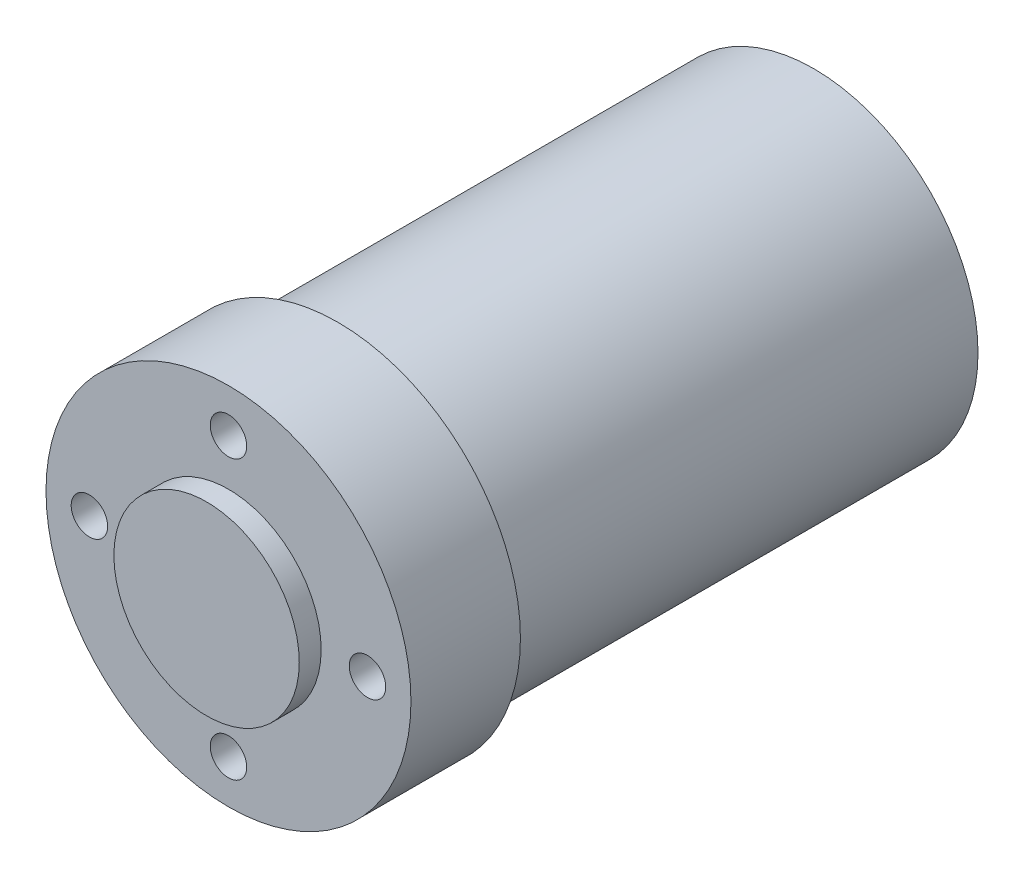
ISO-10303-21;
HEADER;
FILE_DESCRIPTION(('STEP AP214'),'2;1');
FILE_NAME('part.step','',(''),(''),'','','');
FILE_SCHEMA(('AUTOMOTIVE_DESIGN { 1 0 10303 214 1 1 1 1 }'));
ENDSEC;
DATA;
#1=APPLICATION_CONTEXT('core data for automotive mechanical design processes');
#2=APPLICATION_PROTOCOL_DEFINITION('international standard','automotive_design',2000,#1);
#3=PRODUCT_CONTEXT('',#1,'mechanical');
#4=PRODUCT('Part','Part','',(#3));
#5=PRODUCT_RELATED_PRODUCT_CATEGORY('part','',(#4));
#6=PRODUCT_DEFINITION_FORMATION('','',#4);
#7=PRODUCT_DEFINITION_CONTEXT('part definition',#1,'design');
#8=PRODUCT_DEFINITION('design','',#6,#7);
#9=PRODUCT_DEFINITION_SHAPE('','',#8);
#10=(LENGTH_UNIT() NAMED_UNIT(*) SI_UNIT(.MILLI.,.METRE.));
#11=(NAMED_UNIT(*) PLANE_ANGLE_UNIT() SI_UNIT($,.RADIAN.));
#12=(NAMED_UNIT(*) SI_UNIT($,.STERADIAN.) SOLID_ANGLE_UNIT());
#13=UNCERTAINTY_MEASURE_WITH_UNIT(LENGTH_MEASURE(1.E-05),#10,'distance_accuracy_value','');
#14=(GEOMETRIC_REPRESENTATION_CONTEXT(3) GLOBAL_UNCERTAINTY_ASSIGNED_CONTEXT((#13)) GLOBAL_UNIT_ASSIGNED_CONTEXT((#10,
#11,#12)) REPRESENTATION_CONTEXT('',''));
#15=CARTESIAN_POINT('',(0.,0.,0.));
#16=DIRECTION('',(0.,0.,1.));
#17=DIRECTION('',(1.,0.,0.));
#18=AXIS2_PLACEMENT_3D('',#15,#16,#17);
#19=CARTESIAN_POINT('',(0.,0.,80.));
#20=DIRECTION('',(0.,0.,-1.));
#21=DIRECTION('',(-1.,0.,0.));
#22=AXIS2_PLACEMENT_3D('',#19,#20,#21);
#23=CYLINDRICAL_SURFACE('',#22,25.);
#24=CARTESIAN_POINT('',(0.,0.,80.));
#25=DIRECTION('',(0.,0.,-1.));
#26=DIRECTION('',(-1.,0.,0.));
#27=AXIS2_PLACEMENT_3D('',#24,#25,#26);
#28=CIRCLE('',#27,25.);
#29=CARTESIAN_POINT('',(-25.,0.,80.));
#30=VERTEX_POINT('',#29);
#31=EDGE_CURVE('E43',#30,#30,#28,.T.);
#32=ORIENTED_EDGE('',*,*,#31,.T.);
#33=EDGE_LOOP('',(#32));
#34=FACE_BOUND('',#33,.T.);
#35=CARTESIAN_POINT('',(0.,0.,65.));
#36=DIRECTION('',(0.,0.,-1.));
#37=DIRECTION('',(-1.,0.,0.));
#38=AXIS2_PLACEMENT_3D('',#35,#36,#37);
#39=CIRCLE('',#38,25.);
#40=CARTESIAN_POINT('',(-25.,0.,65.));
#41=VERTEX_POINT('',#40);
#42=EDGE_CURVE('E168',#41,#41,#39,.T.);
#43=ORIENTED_EDGE('',*,*,#42,.F.);
#44=EDGE_LOOP('',(#43));
#45=FACE_BOUND('',#44,.T.);
#46=ADVANCED_FACE('F40',(#34,#45),#23,.T.);
#47=CARTESIAN_POINT('',(25.,0.,80.));
#48=DIRECTION('',(0.,0.,1.));
#49=DIRECTION('',(1.,0.,0.));
#50=AXIS2_PLACEMENT_3D('',#47,#48,#49);
#51=PLANE('',#50);
#52=CARTESIAN_POINT('',(-19.0499999999995,-5.41433564649196E-13,80.));
#53=DIRECTION('',(0.,0.,1.));
#54=DIRECTION('',(1.,0.,0.));
#55=AXIS2_PLACEMENT_3D('',#52,#53,#54);
#56=CIRCLE('',#55,2.5);
#57=CARTESIAN_POINT('',(-16.5499999999995,-5.41433564649196E-13,80.));
#58=VERTEX_POINT('',#57);
#59=EDGE_CURVE('E90',#58,#58,#56,.T.);
#60=ORIENTED_EDGE('',*,*,#59,.F.);
#61=EDGE_LOOP('',(#60));
#62=FACE_BOUND('',#61,.T.);
#63=CARTESIAN_POINT('',(1.07820122499364E-12,-19.05,80.));
#64=DIRECTION('',(0.,0.,1.));
#65=DIRECTION('',(1.,0.,0.));
#66=AXIS2_PLACEMENT_3D('',#63,#64,#65);
#67=CIRCLE('',#66,2.5);
#68=CARTESIAN_POINT('',(2.50000000000108,-19.05,80.));
#69=VERTEX_POINT('',#68);
#70=EDGE_CURVE('E89',#69,#69,#67,.T.);
#71=ORIENTED_EDGE('',*,*,#70,.F.);
#72=EDGE_LOOP('',(#71));
#73=FACE_BOUND('',#72,.T.);
#74=CARTESIAN_POINT('',(19.0500000000005,5.39100612496821E-13,80.));
#75=DIRECTION('',(0.,0.,1.));
#76=DIRECTION('',(1.,0.,0.));
#77=AXIS2_PLACEMENT_3D('',#74,#75,#76);
#78=CIRCLE('',#77,2.5);
#79=CARTESIAN_POINT('',(21.5500000000005,5.39100612496821E-13,80.));
#80=VERTEX_POINT('',#79);
#81=EDGE_CURVE('E104',#80,#80,#78,.T.);
#82=ORIENTED_EDGE('',*,*,#81,.F.);
#83=EDGE_LOOP('',(#82));
#84=FACE_BOUND('',#83,.T.);
#85=CARTESIAN_POINT('',(0.,19.05,80.));
#86=DIRECTION('',(0.,0.,1.));
#87=DIRECTION('',(1.,0.,0.));
#88=AXIS2_PLACEMENT_3D('',#85,#86,#87);
#89=CIRCLE('',#88,2.5);
#90=CARTESIAN_POINT('',(2.5,19.05,80.));
#91=VERTEX_POINT('',#90);
#92=EDGE_CURVE('E112',#91,#91,#89,.T.);
#93=ORIENTED_EDGE('',*,*,#92,.F.);
#94=EDGE_LOOP('',(#93));
#95=FACE_BOUND('',#94,.T.);
#96=CARTESIAN_POINT('',(0.,0.,80.));
#97=DIRECTION('',(0.,0.,1.));
#98=DIRECTION('',(1.,0.,0.));
#99=AXIS2_PLACEMENT_3D('',#96,#97,#98);
#100=CIRCLE('',#99,12.7);
#101=CARTESIAN_POINT('',(12.7,0.,80.));
#102=VERTEX_POINT('',#101);
#103=EDGE_CURVE('E49',#102,#102,#100,.T.);
#104=ORIENTED_EDGE('',*,*,#103,.F.);
#105=EDGE_LOOP('',(#104));
#106=FACE_BOUND('',#105,.T.);
#107=ORIENTED_EDGE('',*,*,#31,.F.);
#108=EDGE_LOOP('',(#107));
#109=FACE_BOUND('',#108,.T.);
#110=ADVANCED_FACE('F183',(#62,#73,#84,#95,#106,#109),#51,.T.);
#111=CARTESIAN_POINT('',(0.,0.,65.));
#112=DIRECTION('',(0.,0.,-1.));
#113=DIRECTION('',(-1.,0.,0.));
#114=AXIS2_PLACEMENT_3D('',#111,#112,#113);
#115=PLANE('',#114);
#116=CARTESIAN_POINT('',(0.,0.,65.));
#117=DIRECTION('',(0.,0.,-1.));
#118=DIRECTION('',(-1.,0.,0.));
#119=AXIS2_PLACEMENT_3D('',#116,#117,#118);
#120=CIRCLE('',#119,22.4917);
#121=CARTESIAN_POINT('',(-22.4917,0.,65.));
#122=VERTEX_POINT('',#121);
#123=EDGE_CURVE('E11',#122,#122,#120,.T.);
#124=ORIENTED_EDGE('',*,*,#123,.F.);
#125=EDGE_LOOP('',(#124));
#126=FACE_BOUND('',#125,.T.);
#127=ORIENTED_EDGE('',*,*,#42,.T.);
#128=EDGE_LOOP('',(#127));
#129=FACE_BOUND('',#128,.T.);
#130=ADVANCED_FACE('F185',(#126,#129),#115,.T.);
#131=CARTESIAN_POINT('',(0.,0.,83.));
#132=DIRECTION('',(0.,0.,-1.));
#133=DIRECTION('',(-1.,0.,0.));
#134=AXIS2_PLACEMENT_3D('',#131,#132,#133);
#135=CYLINDRICAL_SURFACE('',#134,12.7);
#136=CARTESIAN_POINT('',(0.,0.,83.));
#137=DIRECTION('',(0.,0.,1.));
#138=DIRECTION('',(1.,0.,0.));
#139=AXIS2_PLACEMENT_3D('',#136,#137,#138);
#140=CIRCLE('',#139,12.7);
#141=CARTESIAN_POINT('',(12.7,0.,83.));
#142=VERTEX_POINT('',#141);
#143=EDGE_CURVE('E163',#142,#142,#140,.T.);
#144=ORIENTED_EDGE('',*,*,#143,.F.);
#145=EDGE_LOOP('',(#144));
#146=FACE_BOUND('',#145,.T.);
#147=ORIENTED_EDGE('',*,*,#103,.T.);
#148=EDGE_LOOP('',(#147));
#149=FACE_BOUND('',#148,.T.);
#150=ADVANCED_FACE('F191',(#146,#149),#135,.T.);
#151=CARTESIAN_POINT('',(0.,0.,83.));
#152=DIRECTION('',(0.,0.,1.));
#153=DIRECTION('',(1.,0.,0.));
#154=AXIS2_PLACEMENT_3D('',#151,#152,#153);
#155=PLANE('',#154);
#156=ORIENTED_EDGE('',*,*,#143,.T.);
#157=EDGE_LOOP('',(#156));
#158=FACE_BOUND('',#157,.T.);
#159=ADVANCED_FACE('F199',(#158),#155,.T.);
#160=CARTESIAN_POINT('',(0.,0.,-0.200000000000006));
#161=DIRECTION('',(0.,0.,1.));
#162=DIRECTION('',(1.,0.,0.));
#163=AXIS2_PLACEMENT_3D('',#160,#161,#162);
#164=CYLINDRICAL_SURFACE('',#163,22.4917);
#165=CARTESIAN_POINT('',(0.,0.,-0.200000000000006));
#166=DIRECTION('',(0.,0.,-1.));
#167=DIRECTION('',(-1.,0.,0.));
#168=AXIS2_PLACEMENT_3D('',#165,#166,#167);
#169=CIRCLE('',#168,22.4917);
#170=CARTESIAN_POINT('',(-22.4917,0.,-0.200000000000006));
#171=VERTEX_POINT('',#170);
#172=EDGE_CURVE('E160',#171,#171,#169,.T.);
#173=ORIENTED_EDGE('',*,*,#172,.F.);
#174=EDGE_LOOP('',(#173));
#175=FACE_BOUND('',#174,.T.);
#176=ORIENTED_EDGE('',*,*,#123,.T.);
#177=EDGE_LOOP('',(#176));
#178=FACE_BOUND('',#177,.T.);
#179=ADVANCED_FACE('F203',(#175,#178),#164,.T.);
#180=CARTESIAN_POINT('',(0.,0.,-0.200000000000006));
#181=DIRECTION('',(0.,0.,-1.));
#182=DIRECTION('',(-1.,0.,0.));
#183=AXIS2_PLACEMENT_3D('',#180,#181,#182);
#184=PLANE('',#183);
#185=CARTESIAN_POINT('',(0.,17.5,-0.200000000000006));
#186=DIRECTION('',(0.,0.,-1.));
#187=DIRECTION('',(-1.,0.,0.));
#188=AXIS2_PLACEMENT_3D('',#185,#186,#187);
#189=CIRCLE('',#188,2.5);
#190=CARTESIAN_POINT('',(-2.5,17.5,-0.200000000000006));
#191=VERTEX_POINT('',#190);
#192=EDGE_CURVE('E120',#191,#191,#189,.T.);
#193=ORIENTED_EDGE('',*,*,#192,.F.);
#194=EDGE_LOOP('',(#193));
#195=FACE_BOUND('',#194,.T.);
#196=CARTESIAN_POINT('',(-16.6434890351657,5.40779740156229,-0.200000000000006));
#197=DIRECTION('',(0.,0.,-1.));
#198=DIRECTION('',(-1.,0.,0.));
#199=AXIS2_PLACEMENT_3D('',#196,#197,#198);
#200=CIRCLE('',#199,2.5);
#201=CARTESIAN_POINT('',(-19.1434890351657,5.40779740156229,-0.200000000000006));
#202=VERTEX_POINT('',#201);
#203=EDGE_CURVE('E128',#202,#202,#200,.T.);
#204=ORIENTED_EDGE('',*,*,#203,.F.);
#205=EDGE_LOOP('',(#204));
#206=FACE_BOUND('',#205,.T.);
#207=CARTESIAN_POINT('',(-10.2862419151196,-14.1577974015611,-0.200000000000006));
#208=DIRECTION('',(0.,0.,-1.));
#209=DIRECTION('',(-1.,0.,0.));
#210=AXIS2_PLACEMENT_3D('',#207,#208,#209);
#211=CIRCLE('',#210,2.5);
#212=CARTESIAN_POINT('',(-12.7862419151196,-14.1577974015611,-0.200000000000006));
#213=VERTEX_POINT('',#212);
#214=EDGE_CURVE('E136',#213,#213,#211,.T.);
#215=ORIENTED_EDGE('',*,*,#214,.F.);
#216=EDGE_LOOP('',(#215));
#217=FACE_BOUND('',#216,.T.);
#218=CARTESIAN_POINT('',(10.2862419151169,-14.157797401562,-0.200000000000006));
#219=DIRECTION('',(0.,0.,-1.));
#220=DIRECTION('',(-1.,0.,0.));
#221=AXIS2_PLACEMENT_3D('',#218,#219,#220);
#222=CIRCLE('',#221,2.5);
#223=CARTESIAN_POINT('',(7.78624191511694,-14.157797401562,-0.200000000000006));
#224=VERTEX_POINT('',#223);
#225=EDGE_CURVE('E144',#224,#224,#222,.T.);
#226=ORIENTED_EDGE('',*,*,#225,.F.);
#227=EDGE_LOOP('',(#226));
#228=FACE_BOUND('',#227,.T.);
#229=CARTESIAN_POINT('',(16.6434890351647,5.40779740156088,-0.200000000000006));
#230=DIRECTION('',(0.,0.,-1.));
#231=DIRECTION('',(-1.,0.,0.));
#232=AXIS2_PLACEMENT_3D('',#229,#230,#231);
#233=CIRCLE('',#232,2.5);
#234=CARTESIAN_POINT('',(14.1434890351647,5.40779740156088,-0.200000000000006));
#235=VERTEX_POINT('',#234);
#236=EDGE_CURVE('E152',#235,#235,#233,.T.);
#237=ORIENTED_EDGE('',*,*,#236,.F.);
#238=EDGE_LOOP('',(#237));
#239=FACE_BOUND('',#238,.T.);
#240=ORIENTED_EDGE('',*,*,#172,.T.);
#241=EDGE_LOOP('',(#240));
#242=FACE_BOUND('',#241,.T.);
#243=ADVANCED_FACE('F207',(#195,#206,#217,#228,#239,#242),#184,.T.);
#244=CARTESIAN_POINT('',(16.6434890351647,5.40779740156088,9.79999999999999));
#245=DIRECTION('',(0.,0.,-1.));
#246=DIRECTION('',(-1.,0.,0.));
#247=AXIS2_PLACEMENT_3D('',#244,#245,#246);
#248=CONICAL_SURFACE('',#247,2.5,1.02974425867665);
#249=CARTESIAN_POINT('',(16.6434890351647,5.40779740156088,11.3021515475689));
#250=VERTEX_POINT('',#249);
#251=VERTEX_LOOP('',#250);
#252=FACE_BOUND('',#251,.T.);
#253=CARTESIAN_POINT('',(16.6434890351647,5.40779740156088,9.79999999999999));
#254=DIRECTION('',(0.,0.,-1.));
#255=DIRECTION('',(-1.,0.,0.));
#256=AXIS2_PLACEMENT_3D('',#253,#254,#255);
#257=CIRCLE('',#256,2.5);
#258=CARTESIAN_POINT('',(14.1434890351647,5.40779740156088,9.79999999999999));
#259=VERTEX_POINT('',#258);
#260=EDGE_CURVE('E156',#259,#259,#257,.T.);
#261=ORIENTED_EDGE('',*,*,#260,.T.);
#262=EDGE_LOOP('',(#261));
#263=FACE_BOUND('',#262,.T.);
#264=ADVANCED_FACE('F211',(#252,#263),#248,.F.);
#265=CARTESIAN_POINT('',(16.6434890351647,5.40779740156088,-0.200000000000006));
#266=DIRECTION('',(0.,0.,-1.));
#267=DIRECTION('',(-1.,0.,0.));
#268=AXIS2_PLACEMENT_3D('',#265,#266,#267);
#269=CYLINDRICAL_SURFACE('',#268,2.5);
#270=ORIENTED_EDGE('',*,*,#260,.F.);
#271=EDGE_LOOP('',(#270));
#272=FACE_BOUND('',#271,.T.);
#273=ORIENTED_EDGE('',*,*,#236,.T.);
#274=EDGE_LOOP('',(#273));
#275=FACE_BOUND('',#274,.T.);
#276=ADVANCED_FACE('F215',(#272,#275),#269,.F.);
#277=CARTESIAN_POINT('',(10.2862419151169,-14.157797401562,9.79999999999999));
#278=DIRECTION('',(0.,0.,-1.));
#279=DIRECTION('',(-1.,0.,0.));
#280=AXIS2_PLACEMENT_3D('',#277,#278,#279);
#281=CONICAL_SURFACE('',#280,2.5,1.02974425867665);
#282=CARTESIAN_POINT('',(10.2862419151169,-14.157797401562,11.3021515475689));
#283=VERTEX_POINT('',#282);
#284=VERTEX_LOOP('',#283);
#285=FACE_BOUND('',#284,.T.);
#286=CARTESIAN_POINT('',(10.2862419151169,-14.157797401562,9.79999999999999));
#287=DIRECTION('',(0.,0.,-1.));
#288=DIRECTION('',(-1.,0.,0.));
#289=AXIS2_PLACEMENT_3D('',#286,#287,#288);
#290=CIRCLE('',#289,2.5);
#291=CARTESIAN_POINT('',(7.78624191511694,-14.157797401562,9.79999999999999));
#292=VERTEX_POINT('',#291);
#293=EDGE_CURVE('E148',#292,#292,#290,.T.);
#294=ORIENTED_EDGE('',*,*,#293,.T.);
#295=EDGE_LOOP('',(#294));
#296=FACE_BOUND('',#295,.T.);
#297=ADVANCED_FACE('F218',(#285,#296),#281,.F.);
#298=CARTESIAN_POINT('',(10.2862419151169,-14.157797401562,-0.200000000000006));
#299=DIRECTION('',(0.,0.,-1.));
#300=DIRECTION('',(-1.,0.,0.));
#301=AXIS2_PLACEMENT_3D('',#298,#299,#300);
#302=CYLINDRICAL_SURFACE('',#301,2.5);
#303=ORIENTED_EDGE('',*,*,#293,.F.);
#304=EDGE_LOOP('',(#303));
#305=FACE_BOUND('',#304,.T.);
#306=ORIENTED_EDGE('',*,*,#225,.T.);
#307=EDGE_LOOP('',(#306));
#308=FACE_BOUND('',#307,.T.);
#309=ADVANCED_FACE('F222',(#305,#308),#302,.F.);
#310=CARTESIAN_POINT('',(-10.2862419151196,-14.1577974015611,9.79999999999999));
#311=DIRECTION('',(0.,0.,-1.));
#312=DIRECTION('',(-1.,0.,0.));
#313=AXIS2_PLACEMENT_3D('',#310,#311,#312);
#314=CONICAL_SURFACE('',#313,2.5,1.02974425867665);
#315=CARTESIAN_POINT('',(-10.2862419151196,-14.1577974015611,11.3021515475689));
#316=VERTEX_POINT('',#315);
#317=VERTEX_LOOP('',#316);
#318=FACE_BOUND('',#317,.T.);
#319=CARTESIAN_POINT('',(-10.2862419151196,-14.1577974015611,9.79999999999999));
#320=DIRECTION('',(0.,0.,-1.));
#321=DIRECTION('',(-1.,0.,0.));
#322=AXIS2_PLACEMENT_3D('',#319,#320,#321);
#323=CIRCLE('',#322,2.5);
#324=CARTESIAN_POINT('',(-12.7862419151196,-14.1577974015611,9.79999999999999));
#325=VERTEX_POINT('',#324);
#326=EDGE_CURVE('E140',#325,#325,#323,.T.);
#327=ORIENTED_EDGE('',*,*,#326,.T.);
#328=EDGE_LOOP('',(#327));
#329=FACE_BOUND('',#328,.T.);
#330=ADVANCED_FACE('F225',(#318,#329),#314,.F.);
#331=CARTESIAN_POINT('',(-10.2862419151196,-14.1577974015611,-0.200000000000006));
#332=DIRECTION('',(0.,0.,-1.));
#333=DIRECTION('',(-1.,0.,0.));
#334=AXIS2_PLACEMENT_3D('',#331,#332,#333);
#335=CYLINDRICAL_SURFACE('',#334,2.5);
#336=ORIENTED_EDGE('',*,*,#326,.F.);
#337=EDGE_LOOP('',(#336));
#338=FACE_BOUND('',#337,.T.);
#339=ORIENTED_EDGE('',*,*,#214,.T.);
#340=EDGE_LOOP('',(#339));
#341=FACE_BOUND('',#340,.T.);
#342=ADVANCED_FACE('F229',(#338,#341),#335,.F.);
#343=CARTESIAN_POINT('',(-16.6434890351657,5.40779740156229,9.79999999999999));
#344=DIRECTION('',(0.,0.,-1.));
#345=DIRECTION('',(-1.,0.,0.));
#346=AXIS2_PLACEMENT_3D('',#343,#344,#345);
#347=CONICAL_SURFACE('',#346,2.5,1.02974425867665);
#348=CARTESIAN_POINT('',(-16.6434890351657,5.40779740156229,11.3021515475689));
#349=VERTEX_POINT('',#348);
#350=VERTEX_LOOP('',#349);
#351=FACE_BOUND('',#350,.T.);
#352=CARTESIAN_POINT('',(-16.6434890351657,5.40779740156229,9.79999999999999));
#353=DIRECTION('',(0.,0.,-1.));
#354=DIRECTION('',(-1.,0.,0.));
#355=AXIS2_PLACEMENT_3D('',#352,#353,#354);
#356=CIRCLE('',#355,2.5);
#357=CARTESIAN_POINT('',(-19.1434890351657,5.40779740156229,9.79999999999999));
#358=VERTEX_POINT('',#357);
#359=EDGE_CURVE('E132',#358,#358,#356,.T.);
#360=ORIENTED_EDGE('',*,*,#359,.T.);
#361=EDGE_LOOP('',(#360));
#362=FACE_BOUND('',#361,.T.);
#363=ADVANCED_FACE('F233',(#351,#362),#347,.F.);
#364=CARTESIAN_POINT('',(-16.6434890351657,5.40779740156229,-0.200000000000006));
#365=DIRECTION('',(0.,0.,-1.));
#366=DIRECTION('',(-1.,0.,0.));
#367=AXIS2_PLACEMENT_3D('',#364,#365,#366);
#368=CYLINDRICAL_SURFACE('',#367,2.5);
#369=ORIENTED_EDGE('',*,*,#359,.F.);
#370=EDGE_LOOP('',(#369));
#371=FACE_BOUND('',#370,.T.);
#372=ORIENTED_EDGE('',*,*,#203,.T.);
#373=EDGE_LOOP('',(#372));
#374=FACE_BOUND('',#373,.T.);
#375=ADVANCED_FACE('F237',(#371,#374),#368,.F.);
#376=CARTESIAN_POINT('',(0.,17.5,9.79999999999999));
#377=DIRECTION('',(0.,0.,-1.));
#378=DIRECTION('',(-1.,0.,0.));
#379=AXIS2_PLACEMENT_3D('',#376,#377,#378);
#380=CONICAL_SURFACE('',#379,2.5,1.02974425867665);
#381=CARTESIAN_POINT('',(0.,17.5,11.3021515475689));
#382=VERTEX_POINT('',#381);
#383=VERTEX_LOOP('',#382);
#384=FACE_BOUND('',#383,.T.);
#385=CARTESIAN_POINT('',(0.,17.5,9.79999999999999));
#386=DIRECTION('',(0.,0.,-1.));
#387=DIRECTION('',(-1.,0.,0.));
#388=AXIS2_PLACEMENT_3D('',#385,#386,#387);
#389=CIRCLE('',#388,2.5);
#390=CARTESIAN_POINT('',(-2.5,17.5,9.79999999999999));
#391=VERTEX_POINT('',#390);
#392=EDGE_CURVE('E124',#391,#391,#389,.T.);
#393=ORIENTED_EDGE('',*,*,#392,.T.);
#394=EDGE_LOOP('',(#393));
#395=FACE_BOUND('',#394,.T.);
#396=ADVANCED_FACE('F241',(#384,#395),#380,.F.);
#397=CARTESIAN_POINT('',(0.,17.5,-0.200000000000006));
#398=DIRECTION('',(0.,0.,-1.));
#399=DIRECTION('',(-1.,0.,0.));
#400=AXIS2_PLACEMENT_3D('',#397,#398,#399);
#401=CYLINDRICAL_SURFACE('',#400,2.5);
#402=ORIENTED_EDGE('',*,*,#392,.F.);
#403=EDGE_LOOP('',(#402));
#404=FACE_BOUND('',#403,.T.);
#405=ORIENTED_EDGE('',*,*,#192,.T.);
#406=EDGE_LOOP('',(#405));
#407=FACE_BOUND('',#406,.T.);
#408=ADVANCED_FACE('F245',(#404,#407),#401,.F.);
#409=CARTESIAN_POINT('',(0.,19.05,65.));
#410=DIRECTION('',(0.,0.,1.));
#411=DIRECTION('',(1.,0.,0.));
#412=AXIS2_PLACEMENT_3D('',#409,#410,#411);
#413=CONICAL_SURFACE('',#412,2.5,1.02974425867665);
#414=CARTESIAN_POINT('',(0.,19.05,63.4978484524311));
#415=VERTEX_POINT('',#414);
#416=VERTEX_LOOP('',#415);
#417=FACE_BOUND('',#416,.T.);
#418=CARTESIAN_POINT('',(0.,19.05,65.));
#419=DIRECTION('',(0.,0.,1.));
#420=DIRECTION('',(1.,0.,0.));
#421=AXIS2_PLACEMENT_3D('',#418,#419,#420);
#422=CIRCLE('',#421,2.5);
#423=CARTESIAN_POINT('',(2.5,19.05,65.));
#424=VERTEX_POINT('',#423);
#425=EDGE_CURVE('E116',#424,#424,#422,.T.);
#426=ORIENTED_EDGE('',*,*,#425,.T.);
#427=EDGE_LOOP('',(#426));
#428=FACE_BOUND('',#427,.T.);
#429=ADVANCED_FACE('F249',(#417,#428),#413,.F.);
#430=CARTESIAN_POINT('',(0.,19.05,80.));
#431=DIRECTION('',(0.,0.,1.));
#432=DIRECTION('',(1.,0.,0.));
#433=AXIS2_PLACEMENT_3D('',#430,#431,#432);
#434=CYLINDRICAL_SURFACE('',#433,2.5);
#435=ORIENTED_EDGE('',*,*,#425,.F.);
#436=EDGE_LOOP('',(#435));
#437=FACE_BOUND('',#436,.T.);
#438=ORIENTED_EDGE('',*,*,#92,.T.);
#439=EDGE_LOOP('',(#438));
#440=FACE_BOUND('',#439,.T.);
#441=ADVANCED_FACE('F253',(#437,#440),#434,.F.);
#442=CARTESIAN_POINT('',(19.0500000000005,5.39100612496821E-13,65.));
#443=DIRECTION('',(0.,0.,1.));
#444=DIRECTION('',(1.,0.,0.));
#445=AXIS2_PLACEMENT_3D('',#442,#443,#444);
#446=CONICAL_SURFACE('',#445,2.5,1.02974425867665);
#447=CARTESIAN_POINT('',(19.0500000000005,5.39100612496821E-13,63.4978484524311));
#448=VERTEX_POINT('',#447);
#449=VERTEX_LOOP('',#448);
#450=FACE_BOUND('',#449,.T.);
#451=CARTESIAN_POINT('',(19.0500000000005,5.39100612496821E-13,65.));
#452=DIRECTION('',(0.,0.,1.));
#453=DIRECTION('',(1.,0.,0.));
#454=AXIS2_PLACEMENT_3D('',#451,#452,#453);
#455=CIRCLE('',#454,2.5);
#456=CARTESIAN_POINT('',(21.5500000000005,5.39100612496821E-13,65.));
#457=VERTEX_POINT('',#456);
#458=EDGE_CURVE('E108',#457,#457,#455,.T.);
#459=ORIENTED_EDGE('',*,*,#458,.T.);
#460=EDGE_LOOP('',(#459));
#461=FACE_BOUND('',#460,.T.);
#462=ADVANCED_FACE('F257',(#450,#461),#446,.F.);
#463=CARTESIAN_POINT('',(19.0500000000005,5.39100612496821E-13,80.));
#464=DIRECTION('',(0.,0.,1.));
#465=DIRECTION('',(1.,0.,0.));
#466=AXIS2_PLACEMENT_3D('',#463,#464,#465);
#467=CYLINDRICAL_SURFACE('',#466,2.5);
#468=ORIENTED_EDGE('',*,*,#458,.F.);
#469=EDGE_LOOP('',(#468));
#470=FACE_BOUND('',#469,.T.);
#471=ORIENTED_EDGE('',*,*,#81,.T.);
#472=EDGE_LOOP('',(#471));
#473=FACE_BOUND('',#472,.T.);
#474=ADVANCED_FACE('F261',(#470,#473),#467,.F.);
#475=CARTESIAN_POINT('',(1.07820122499364E-12,-19.05,65.));
#476=DIRECTION('',(0.,0.,1.));
#477=DIRECTION('',(1.,0.,0.));
#478=AXIS2_PLACEMENT_3D('',#475,#476,#477);
#479=CONICAL_SURFACE('',#478,2.5,1.02974425867665);
#480=CARTESIAN_POINT('',(1.07415936357929E-12,-19.05,63.4978484524311));
#481=VERTEX_POINT('',#480);
#482=VERTEX_LOOP('',#481);
#483=FACE_BOUND('',#482,.T.);
#484=CARTESIAN_POINT('',(1.07820122499364E-12,-19.05,65.));
#485=DIRECTION('',(0.,0.,1.));
#486=DIRECTION('',(1.,0.,0.));
#487=AXIS2_PLACEMENT_3D('',#484,#485,#486);
#488=CIRCLE('',#487,2.5);
#489=CARTESIAN_POINT('',(2.50000000000107,-19.05,65.));
#490=VERTEX_POINT('',#489);
#491=EDGE_CURVE('E96',#490,#490,#488,.T.);
#492=ORIENTED_EDGE('',*,*,#491,.T.);
#493=EDGE_LOOP('',(#492));
#494=FACE_BOUND('',#493,.T.);
#495=ADVANCED_FACE('F265',(#483,#494),#479,.F.);
#496=CARTESIAN_POINT('',(1.07820122499364E-12,-19.05,80.));
#497=DIRECTION('',(0.,0.,1.));
#498=DIRECTION('',(1.,0.,0.));
#499=AXIS2_PLACEMENT_3D('',#496,#497,#498);
#500=CYLINDRICAL_SURFACE('',#499,2.5);
#501=ORIENTED_EDGE('',*,*,#491,.F.);
#502=EDGE_LOOP('',(#501));
#503=FACE_BOUND('',#502,.T.);
#504=ORIENTED_EDGE('',*,*,#70,.T.);
#505=EDGE_LOOP('',(#504));
#506=FACE_BOUND('',#505,.T.);
#507=ADVANCED_FACE('F82',(#503,#506),#500,.F.);
#508=CARTESIAN_POINT('',(-19.0499999999995,-5.41433564649196E-13,65.));
#509=DIRECTION('',(0.,0.,1.));
#510=DIRECTION('',(1.,0.,0.));
#511=AXIS2_PLACEMENT_3D('',#508,#509,#510);
#512=CONICAL_SURFACE('',#511,2.5,1.02974425867665);
#513=CARTESIAN_POINT('',(-19.0499999999995,-5.41433564649196E-13,63.4978484524311));
#514=VERTEX_POINT('',#513);
#515=VERTEX_LOOP('',#514);
#516=FACE_BOUND('',#515,.T.);
#517=CARTESIAN_POINT('',(-19.0499999999995,-5.41433564649196E-13,65.));
#518=DIRECTION('',(0.,0.,1.));
#519=DIRECTION('',(1.,0.,0.));
#520=AXIS2_PLACEMENT_3D('',#517,#518,#519);
#521=CIRCLE('',#520,2.5);
#522=CARTESIAN_POINT('',(-16.5499999999995,-5.41433564649196E-13,65.));
#523=VERTEX_POINT('',#522);
#524=EDGE_CURVE('E86',#523,#523,#521,.T.);
#525=ORIENTED_EDGE('',*,*,#524,.T.);
#526=EDGE_LOOP('',(#525));
#527=FACE_BOUND('',#526,.T.);
#528=ADVANCED_FACE('F78',(#516,#527),#512,.F.);
#529=CARTESIAN_POINT('',(-19.0499999999995,-5.41433564649196E-13,80.));
#530=DIRECTION('',(0.,0.,1.));
#531=DIRECTION('',(1.,0.,0.));
#532=AXIS2_PLACEMENT_3D('',#529,#530,#531);
#533=CYLINDRICAL_SURFACE('',#532,2.5);
#534=ORIENTED_EDGE('',*,*,#524,.F.);
#535=EDGE_LOOP('',(#534));
#536=FACE_BOUND('',#535,.T.);
#537=ORIENTED_EDGE('',*,*,#59,.T.);
#538=EDGE_LOOP('',(#537));
#539=FACE_BOUND('',#538,.T.);
#540=ADVANCED_FACE('F81',(#536,#539),#533,.F.);
#541=CLOSED_SHELL('',(#46,#110,#130,#150,#159,#179,#243,#264,#276,#297,#309,#330,#342,#363,#375,
#396,#408,#429,#441,#462,#474,#495,#507,#528,#540));
#542=MANIFOLD_SOLID_BREP('B2',#541);
#543=ADVANCED_BREP_SHAPE_REPRESENTATION('',(#18,#542),#14);
#544=SHAPE_DEFINITION_REPRESENTATION(#9,#543);
ENDSEC;
END-ISO-10303-21;
